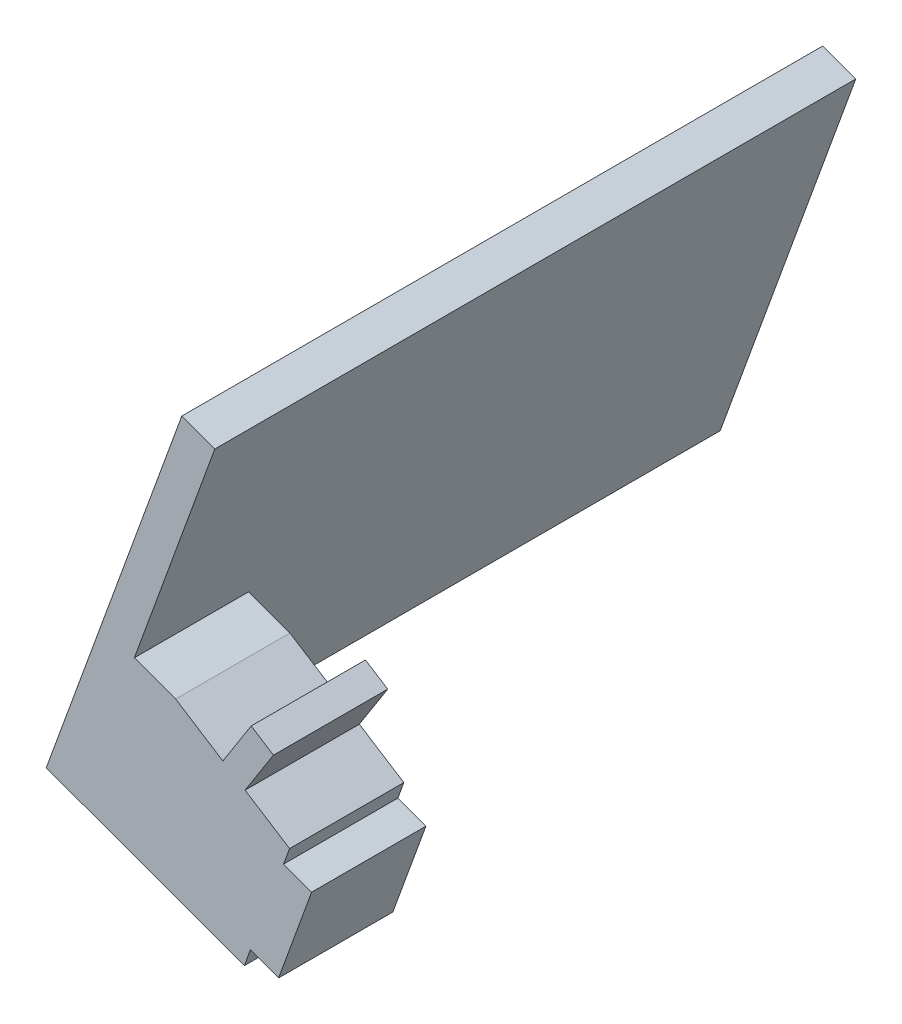
ISO-10303-21;
HEADER;
FILE_DESCRIPTION(('STEP AP214'),'2;1');
FILE_NAME('part.step','',(''),(''),'','','');
FILE_SCHEMA(('AUTOMOTIVE_DESIGN { 1 0 10303 214 1 1 1 1 }'));
ENDSEC;
DATA;
#1=APPLICATION_CONTEXT('core data for automotive mechanical design processes');
#2=APPLICATION_PROTOCOL_DEFINITION('international standard','automotive_design',2000,#1);
#3=PRODUCT_CONTEXT('',#1,'mechanical');
#4=PRODUCT('Part','Part','',(#3));
#5=PRODUCT_RELATED_PRODUCT_CATEGORY('part','',(#4));
#6=PRODUCT_DEFINITION_FORMATION('','',#4);
#7=PRODUCT_DEFINITION_CONTEXT('part definition',#1,'design');
#8=PRODUCT_DEFINITION('design','',#6,#7);
#9=PRODUCT_DEFINITION_SHAPE('','',#8);
#10=(LENGTH_UNIT() NAMED_UNIT(*) SI_UNIT(.MILLI.,.METRE.));
#11=(NAMED_UNIT(*) PLANE_ANGLE_UNIT() SI_UNIT($,.RADIAN.));
#12=(NAMED_UNIT(*) SI_UNIT($,.STERADIAN.) SOLID_ANGLE_UNIT());
#13=UNCERTAINTY_MEASURE_WITH_UNIT(LENGTH_MEASURE(1.E-05),#10,'distance_accuracy_value','');
#14=(GEOMETRIC_REPRESENTATION_CONTEXT(3) GLOBAL_UNCERTAINTY_ASSIGNED_CONTEXT((#13)) GLOBAL_UNIT_ASSIGNED_CONTEXT((#10,
#11,#12)) REPRESENTATION_CONTEXT('',''));
#15=CARTESIAN_POINT('',(0.,0.,0.));
#16=DIRECTION('',(0.,0.,1.));
#17=DIRECTION('',(1.,0.,0.));
#18=AXIS2_PLACEMENT_3D('',#15,#16,#17);
#19=CARTESIAN_POINT('',(26.5891749560917,8.90987720718114,67.31));
#20=DIRECTION('',(0.342020143325674,0.939692620785907,0.));
#21=DIRECTION('',(-0.939692620785907,0.342020143325674,0.));
#22=AXIS2_PLACEMENT_3D('',#19,#20,#21);
#23=PLANE('',#22);
#24=DIRECTION('',(0.939692620785906,-0.342020143325674,0.));
#25=VECTOR('',#24,1.);
#26=CARTESIAN_POINT('',(26.5891749560917,8.90987720718114,50.8));
#27=LINE('',#26,#25);
#28=CARTESIAN_POINT('',(2.72098238812966,17.5971888476533,50.8));
#29=VERTEX_POINT('',#28);
#30=CARTESIAN_POINT('',(26.5891749560917,8.90987720718114,50.8));
#31=VERTEX_POINT('',#30);
#32=EDGE_CURVE('E207',#29,#31,#27,.T.);
#33=ORIENTED_EDGE('',*,*,#32,.T.);
#34=DIRECTION('',(0.,0.,-1.));
#35=VECTOR('',#34,1.);
#36=CARTESIAN_POINT('',(26.5891749560917,8.90987720718114,67.31));
#37=LINE('',#36,#35);
#38=CARTESIAN_POINT('',(26.5891749560917,8.90987720718114,67.31));
#39=VERTEX_POINT('',#38);
#40=EDGE_CURVE('E11',#39,#31,#37,.T.);
#41=ORIENTED_EDGE('',*,*,#40,.F.);
#42=DIRECTION('',(0.939692620785906,-0.342020143325674,0.));
#43=VECTOR('',#42,1.);
#44=CARTESIAN_POINT('',(26.5891749560917,8.90987720718114,67.31));
#45=LINE('',#44,#43);
#46=CARTESIAN_POINT('',(-2.05265612546275,19.3346511757477,67.31));
#47=VERTEX_POINT('',#46);
#48=EDGE_CURVE('E140',#47,#39,#45,.T.);
#49=ORIENTED_EDGE('',*,*,#48,.F.);
#50=DIRECTION('',(0.,0.,-1.));
#51=VECTOR('',#50,1.);
#52=CARTESIAN_POINT('',(-2.05265612546275,19.3346511757477,23.6434303938957));
#53=LINE('',#52,#51);
#54=CARTESIAN_POINT('',(-2.05265612546274,19.3346511757477,-25.2953200481443));
#55=VERTEX_POINT('',#54);
#56=EDGE_CURVE('E145',#47,#55,#53,.T.);
#57=ORIENTED_EDGE('',*,*,#56,.T.);
#58=DIRECTION('',(0.939692620785906,-0.342020143325674,0.));
#59=VECTOR('',#58,1.);
#60=CARTESIAN_POINT('',(-2.05265612546274,19.3346511757477,-25.2953200481443));
#61=LINE('',#60,#59);
#62=CARTESIAN_POINT('',(2.72098238812966,17.5971888476533,-25.2953200481443));
#63=VERTEX_POINT('',#62);
#64=EDGE_CURVE('E172',#55,#63,#61,.T.);
#65=ORIENTED_EDGE('',*,*,#64,.T.);
#66=DIRECTION('',(0.,0.,-1.));
#67=VECTOR('',#66,1.);
#68=CARTESIAN_POINT('',(2.72098238812966,17.5971888476533,23.6434303938957));
#69=LINE('',#68,#67);
#70=EDGE_CURVE('E173',#29,#63,#69,.T.);
#71=ORIENTED_EDGE('',*,*,#70,.F.);
#72=EDGE_LOOP('',(#33,#41,#49,#57,#65,#71));
#73=FACE_BOUND('',#72,.T.);
#74=ADVANCED_FACE('F33',(#73),#23,.F.);
#75=CARTESIAN_POINT('',(27.4307878496081,11.3065667072553,67.31));
#76=DIRECTION('',(-0.943517647033136,0.331322274737234,0.));
#77=DIRECTION('',(-0.331322274737234,-0.943517647033136,0.));
#78=AXIS2_PLACEMENT_3D('',#75,#76,#77);
#79=PLANE('',#78);
#80=DIRECTION('',(0.331322274737234,0.943517647033136,0.));
#81=VECTOR('',#80,1.);
#82=CARTESIAN_POINT('',(27.4307878496081,11.3065667072553,50.8));
#83=LINE('',#82,#81);
#84=CARTESIAN_POINT('',(27.4307878496081,11.3065667072553,50.8));
#85=VERTEX_POINT('',#84);
#86=EDGE_CURVE('E209',#31,#85,#83,.T.);
#87=ORIENTED_EDGE('',*,*,#86,.T.);
#88=DIRECTION('',(0.,0.,-1.));
#89=VECTOR('',#88,1.);
#90=CARTESIAN_POINT('',(27.4307878496081,11.3065667072553,67.31));
#91=LINE('',#90,#89);
#92=CARTESIAN_POINT('',(27.4307878496081,11.3065667072553,67.31));
#93=VERTEX_POINT('',#92);
#94=EDGE_CURVE('E41',#93,#85,#91,.T.);
#95=ORIENTED_EDGE('',*,*,#94,.F.);
#96=DIRECTION('',(0.331322274737234,0.943517647033136,0.));
#97=VECTOR('',#96,1.);
#98=CARTESIAN_POINT('',(27.4307878496081,11.3065667072553,67.31));
#99=LINE('',#98,#97);
#100=EDGE_CURVE('E148',#39,#93,#99,.T.);
#101=ORIENTED_EDGE('',*,*,#100,.F.);
#102=ORIENTED_EDGE('',*,*,#40,.T.);
#103=EDGE_LOOP('',(#87,#95,#101,#102));
#104=FACE_BOUND('',#103,.T.);
#105=ADVANCED_FACE('F276',(#104),#79,.F.);
#106=CARTESIAN_POINT('',(31.5154988566924,9.81985348509709,67.31));
#107=DIRECTION('',(0.342020143325674,0.939692620785906,0.));
#108=DIRECTION('',(-0.939692620785906,0.342020143325674,0.));
#109=AXIS2_PLACEMENT_3D('',#106,#107,#108);
#110=PLANE('',#109);
#111=DIRECTION('',(0.939692620785907,-0.342020143325674,0.));
#112=VECTOR('',#111,1.);
#113=CARTESIAN_POINT('',(31.5154988566924,9.81985348509709,50.8));
#114=LINE('',#113,#112);
#115=CARTESIAN_POINT('',(31.5154988566924,9.81985348509709,50.8));
#116=VERTEX_POINT('',#115);
#117=EDGE_CURVE('E212',#85,#116,#114,.T.);
#118=ORIENTED_EDGE('',*,*,#117,.T.);
#119=DIRECTION('',(0.,0.,-1.));
#120=VECTOR('',#119,1.);
#121=CARTESIAN_POINT('',(31.5154988566924,9.81985348509709,67.31));
#122=LINE('',#121,#120);
#123=CARTESIAN_POINT('',(31.5154988566924,9.81985348509709,67.31));
#124=VERTEX_POINT('',#123);
#125=EDGE_CURVE('E267',#124,#116,#122,.T.);
#126=ORIENTED_EDGE('',*,*,#125,.F.);
#127=DIRECTION('',(0.939692620785907,-0.342020143325674,0.));
#128=VECTOR('',#127,1.);
#129=CARTESIAN_POINT('',(31.5154988566924,9.81985348509709,67.31));
#130=LINE('',#129,#128);
#131=EDGE_CURVE('E185',#93,#124,#130,.T.);
#132=ORIENTED_EDGE('',*,*,#131,.F.);
#133=ORIENTED_EDGE('',*,*,#94,.T.);
#134=EDGE_LOOP('',(#118,#126,#132,#133));
#135=FACE_BOUND('',#134,.T.);
#136=ADVANCED_FACE('F273',(#135),#110,.F.);
#137=CARTESIAN_POINT('',(36.2935202589521,22.9473593974762,67.31));
#138=DIRECTION('',(-0.939692620785906,0.342020143325674,0.));
#139=DIRECTION('',(-0.342020143325674,-0.939692620785906,0.));
#140=AXIS2_PLACEMENT_3D('',#137,#138,#139);
#141=PLANE('',#140);
#142=DIRECTION('',(0.342020143325674,0.939692620785907,0.));
#143=VECTOR('',#142,1.);
#144=CARTESIAN_POINT('',(36.2935202589521,22.9473593974762,50.8));
#145=LINE('',#144,#143);
#146=CARTESIAN_POINT('',(36.2935202589521,22.9473593974762,50.8));
#147=VERTEX_POINT('',#146);
#148=EDGE_CURVE('E215',#116,#147,#145,.T.);
#149=ORIENTED_EDGE('',*,*,#148,.T.);
#150=DIRECTION('',(0.,0.,-1.));
#151=VECTOR('',#150,1.);
#152=CARTESIAN_POINT('',(36.2935202589521,22.9473593974762,67.31));
#153=LINE('',#152,#151);
#154=CARTESIAN_POINT('',(36.2935202589521,22.9473593974762,67.31));
#155=VERTEX_POINT('',#154);
#156=EDGE_CURVE('E264',#155,#147,#153,.T.);
#157=ORIENTED_EDGE('',*,*,#156,.F.);
#158=DIRECTION('',(0.342020143325674,0.939692620785907,0.));
#159=VECTOR('',#158,1.);
#160=CARTESIAN_POINT('',(36.2935202589521,22.9473593974762,67.31));
#161=LINE('',#160,#159);
#162=EDGE_CURVE('E187',#124,#155,#161,.T.);
#163=ORIENTED_EDGE('',*,*,#162,.F.);
#164=ORIENTED_EDGE('',*,*,#125,.T.);
#165=EDGE_LOOP('',(#149,#157,#163,#164));
#166=FACE_BOUND('',#165,.T.);
#167=ADVANCED_FACE('F317',(#166),#141,.F.);
#168=CARTESIAN_POINT('',(32.2389763793897,24.4325790420947,67.31));
#169=DIRECTION('',(-0.343959351478395,-0.938984539026369,0.));
#170=DIRECTION('',(0.938984539026369,-0.343959351478395,0.));
#171=AXIS2_PLACEMENT_3D('',#168,#169,#170);
#172=PLANE('',#171);
#173=DIRECTION('',(-0.938984539026369,0.343959351478395,0.));
#174=VECTOR('',#173,1.);
#175=CARTESIAN_POINT('',(32.2389763793897,24.4325790420947,50.8));
#176=LINE('',#175,#174);
#177=CARTESIAN_POINT('',(32.2389763793897,24.4325790420947,50.8));
#178=VERTEX_POINT('',#177);
#179=EDGE_CURVE('E218',#147,#178,#176,.T.);
#180=ORIENTED_EDGE('',*,*,#179,.T.);
#181=DIRECTION('',(0.,0.,-1.));
#182=VECTOR('',#181,1.);
#183=CARTESIAN_POINT('',(32.2389763793897,24.4325790420947,67.31));
#184=LINE('',#183,#182);
#185=CARTESIAN_POINT('',(32.2389763793897,24.4325790420947,67.31));
#186=VERTEX_POINT('',#185);
#187=EDGE_CURVE('E261',#186,#178,#184,.T.);
#188=ORIENTED_EDGE('',*,*,#187,.F.);
#189=DIRECTION('',(-0.938984539026369,0.343959351478395,0.));
#190=VECTOR('',#189,1.);
#191=CARTESIAN_POINT('',(32.2389763793897,24.4325790420947,67.31));
#192=LINE('',#191,#190);
#193=EDGE_CURVE('E189',#155,#186,#192,.T.);
#194=ORIENTED_EDGE('',*,*,#193,.F.);
#195=ORIENTED_EDGE('',*,*,#156,.T.);
#196=EDGE_LOOP('',(#180,#188,#194,#195));
#197=FACE_BOUND('',#196,.T.);
#198=ADVANCED_FACE('F314',(#197),#172,.F.);
#199=CARTESIAN_POINT('',(33.1046586864458,26.8110216331527,67.31));
#200=DIRECTION('',(-0.939692620785906,0.342020143325674,0.));
#201=DIRECTION('',(-0.342020143325674,-0.939692620785906,0.));
#202=AXIS2_PLACEMENT_3D('',#199,#200,#201);
#203=PLANE('',#202);
#204=DIRECTION('',(0.342020143325674,0.939692620785906,0.));
#205=VECTOR('',#204,1.);
#206=CARTESIAN_POINT('',(33.1046586864458,26.8110216331527,50.8));
#207=LINE('',#206,#205);
#208=CARTESIAN_POINT('',(33.1046586864458,26.8110216331527,50.8));
#209=VERTEX_POINT('',#208);
#210=EDGE_CURVE('E221',#178,#209,#207,.T.);
#211=ORIENTED_EDGE('',*,*,#210,.T.);
#212=DIRECTION('',(0.,0.,-1.));
#213=VECTOR('',#212,1.);
#214=CARTESIAN_POINT('',(33.1046586864458,26.8110216331527,67.31));
#215=LINE('',#214,#213);
#216=CARTESIAN_POINT('',(33.1046586864458,26.8110216331527,67.31));
#217=VERTEX_POINT('',#216);
#218=EDGE_CURVE('E258',#217,#209,#215,.T.);
#219=ORIENTED_EDGE('',*,*,#218,.F.);
#220=DIRECTION('',(0.342020143325674,0.939692620785906,0.));
#221=VECTOR('',#220,1.);
#222=CARTESIAN_POINT('',(33.1046586864458,26.8110216331527,67.31));
#223=LINE('',#222,#221);
#224=EDGE_CURVE('E191',#186,#217,#223,.T.);
#225=ORIENTED_EDGE('',*,*,#224,.F.);
#226=ORIENTED_EDGE('',*,*,#187,.T.);
#227=EDGE_LOOP('',(#211,#219,#225,#226));
#228=FACE_BOUND('',#227,.T.);
#229=ADVANCED_FACE('F309',(#228),#203,.F.);
#230=CARTESIAN_POINT('',(26.6780158693516,30.9052446487555,67.31));
#231=DIRECTION('',(-0.537299608346825,-0.843391445812885,0.));
#232=DIRECTION('',(0.843391445812885,-0.537299608346825,0.));
#233=AXIS2_PLACEMENT_3D('',#230,#231,#232);
#234=PLANE('',#233);
#235=DIRECTION('',(-0.843391445812885,0.537299608346825,0.));
#236=VECTOR('',#235,1.);
#237=CARTESIAN_POINT('',(26.6780158693516,30.9052446487555,50.8));
#238=LINE('',#237,#236);
#239=CARTESIAN_POINT('',(26.6780158693516,30.9052446487555,50.8));
#240=VERTEX_POINT('',#239);
#241=EDGE_CURVE('E224',#209,#240,#238,.T.);
#242=ORIENTED_EDGE('',*,*,#241,.T.);
#243=DIRECTION('',(0.,0.,-1.));
#244=VECTOR('',#243,1.);
#245=CARTESIAN_POINT('',(26.6780158693516,30.9052446487555,67.31));
#246=LINE('',#245,#244);
#247=CARTESIAN_POINT('',(26.6780158693516,30.9052446487555,67.31));
#248=VERTEX_POINT('',#247);
#249=EDGE_CURVE('E255',#248,#240,#246,.T.);
#250=ORIENTED_EDGE('',*,*,#249,.F.);
#251=DIRECTION('',(-0.843391445812885,0.537299608346825,0.));
#252=VECTOR('',#251,1.);
#253=CARTESIAN_POINT('',(26.6780158693516,30.9052446487555,67.31));
#254=LINE('',#253,#252);
#255=EDGE_CURVE('E193',#217,#248,#254,.T.);
#256=ORIENTED_EDGE('',*,*,#255,.F.);
#257=ORIENTED_EDGE('',*,*,#218,.T.);
#258=EDGE_LOOP('',(#242,#250,#256,#257));
#259=FACE_BOUND('',#258,.T.);
#260=ADVANCED_FACE('F306',(#259),#234,.F.);
#261=CARTESIAN_POINT('',(30.7722388849544,37.3318874658497,67.31));
#262=DIRECTION('',(-0.843391445812884,0.537299608346826,0.));
#263=DIRECTION('',(-0.537299608346826,-0.843391445812884,0.));
#264=AXIS2_PLACEMENT_3D('',#261,#262,#263);
#265=PLANE('',#264);
#266=DIRECTION('',(0.537299608346826,0.843391445812884,0.));
#267=VECTOR('',#266,1.);
#268=CARTESIAN_POINT('',(30.7722388849544,37.3318874658497,50.8));
#269=LINE('',#268,#267);
#270=CARTESIAN_POINT('',(30.7722388849544,37.3318874658497,50.8));
#271=VERTEX_POINT('',#270);
#272=EDGE_CURVE('E227',#240,#271,#269,.T.);
#273=ORIENTED_EDGE('',*,*,#272,.T.);
#274=DIRECTION('',(0.,0.,-1.));
#275=VECTOR('',#274,1.);
#276=CARTESIAN_POINT('',(30.7722388849544,37.3318874658497,67.31));
#277=LINE('',#276,#275);
#278=CARTESIAN_POINT('',(30.7722388849544,37.3318874658497,67.31));
#279=VERTEX_POINT('',#278);
#280=EDGE_CURVE('E252',#279,#271,#277,.T.);
#281=ORIENTED_EDGE('',*,*,#280,.F.);
#282=DIRECTION('',(0.537299608346826,0.843391445812884,0.));
#283=VECTOR('',#282,1.);
#284=CARTESIAN_POINT('',(30.7722388849544,37.3318874658497,67.31));
#285=LINE('',#284,#283);
#286=EDGE_CURVE('E195',#248,#279,#285,.T.);
#287=ORIENTED_EDGE('',*,*,#286,.F.);
#288=ORIENTED_EDGE('',*,*,#249,.T.);
#289=EDGE_LOOP('',(#273,#281,#287,#288));
#290=FACE_BOUND('',#289,.T.);
#291=ADVANCED_FACE('F301',(#290),#265,.F.);
#292=CARTESIAN_POINT('',(27.5589174764073,39.3789989736511,67.31));
#293=DIRECTION('',(-0.537299608346826,-0.843391445812884,0.));
#294=DIRECTION('',(0.843391445812884,-0.537299608346826,0.));
#295=AXIS2_PLACEMENT_3D('',#292,#293,#294);
#296=PLANE('',#295);
#297=DIRECTION('',(-0.843391445812884,0.537299608346826,0.));
#298=VECTOR('',#297,1.);
#299=CARTESIAN_POINT('',(27.5589174764073,39.3789989736511,50.8));
#300=LINE('',#299,#298);
#301=CARTESIAN_POINT('',(27.5589174764073,39.3789989736511,50.8));
#302=VERTEX_POINT('',#301);
#303=EDGE_CURVE('E230',#271,#302,#300,.T.);
#304=ORIENTED_EDGE('',*,*,#303,.T.);
#305=DIRECTION('',(0.,0.,-1.));
#306=VECTOR('',#305,1.);
#307=CARTESIAN_POINT('',(27.5589174764073,39.3789989736511,67.31));
#308=LINE('',#307,#306);
#309=CARTESIAN_POINT('',(27.5589174764073,39.3789989736511,67.31));
#310=VERTEX_POINT('',#309);
#311=EDGE_CURVE('E249',#310,#302,#308,.T.);
#312=ORIENTED_EDGE('',*,*,#311,.F.);
#313=DIRECTION('',(-0.843391445812884,0.537299608346826,0.));
#314=VECTOR('',#313,1.);
#315=CARTESIAN_POINT('',(27.5589174764073,39.3789989736511,67.31));
#316=LINE('',#315,#314);
#317=EDGE_CURVE('E197',#279,#310,#316,.T.);
#318=ORIENTED_EDGE('',*,*,#317,.F.);
#319=ORIENTED_EDGE('',*,*,#280,.T.);
#320=EDGE_LOOP('',(#304,#312,#318,#319));
#321=FACE_BOUND('',#320,.T.);
#322=ADVANCED_FACE('F298',(#321),#296,.F.);
#323=CARTESIAN_POINT('',(23.4646944608045,32.9523561565569,67.31));
#324=DIRECTION('',(0.843391445812884,-0.537299608346827,0.));
#325=DIRECTION('',(0.537299608346827,0.843391445812884,0.));
#326=AXIS2_PLACEMENT_3D('',#323,#324,#325);
#327=PLANE('',#326);
#328=DIRECTION('',(-0.537299608346827,-0.843391445812884,0.));
#329=VECTOR('',#328,1.);
#330=CARTESIAN_POINT('',(23.4646944608045,32.9523561565569,50.8));
#331=LINE('',#330,#329);
#332=CARTESIAN_POINT('',(23.4646944608045,32.9523561565569,50.8));
#333=VERTEX_POINT('',#332);
#334=EDGE_CURVE('E233',#302,#333,#331,.T.);
#335=ORIENTED_EDGE('',*,*,#334,.T.);
#336=DIRECTION('',(0.,0.,-1.));
#337=VECTOR('',#336,1.);
#338=CARTESIAN_POINT('',(23.4646944608045,32.9523561565569,67.31));
#339=LINE('',#338,#337);
#340=CARTESIAN_POINT('',(23.4646944608045,32.9523561565569,67.31));
#341=VERTEX_POINT('',#340);
#342=EDGE_CURVE('E246',#341,#333,#339,.T.);
#343=ORIENTED_EDGE('',*,*,#342,.F.);
#344=DIRECTION('',(-0.537299608346827,-0.843391445812884,0.));
#345=VECTOR('',#344,1.);
#346=CARTESIAN_POINT('',(23.4646944608045,32.9523561565569,67.31));
#347=LINE('',#346,#345);
#348=EDGE_CURVE('E199',#310,#341,#347,.T.);
#349=ORIENTED_EDGE('',*,*,#348,.F.);
#350=ORIENTED_EDGE('',*,*,#311,.T.);
#351=EDGE_LOOP('',(#335,#343,#349,#350));
#352=FACE_BOUND('',#351,.T.);
#353=ADVANCED_FACE('F293',(#352),#327,.F.);
#354=CARTESIAN_POINT('',(16.6479622280307,37.295093537945,67.31));
#355=DIRECTION('',(-0.537299608346825,-0.843391445812885,0.));
#356=DIRECTION('',(0.843391445812885,-0.537299608346825,0.));
#357=AXIS2_PLACEMENT_3D('',#354,#355,#356);
#358=PLANE('',#357);
#359=DIRECTION('',(-0.843391445812885,0.537299608346825,0.));
#360=VECTOR('',#359,1.);
#361=CARTESIAN_POINT('',(16.6479622280307,37.295093537945,50.8));
#362=LINE('',#361,#360);
#363=CARTESIAN_POINT('',(16.6479622280307,37.295093537945,50.8));
#364=VERTEX_POINT('',#363);
#365=EDGE_CURVE('E236',#333,#364,#362,.T.);
#366=ORIENTED_EDGE('',*,*,#365,.T.);
#367=DIRECTION('',(0.,0.,-1.));
#368=VECTOR('',#367,1.);
#369=CARTESIAN_POINT('',(16.6479622280307,37.295093537945,67.31));
#370=LINE('',#369,#368);
#371=CARTESIAN_POINT('',(16.6479622280307,37.295093537945,67.31));
#372=VERTEX_POINT('',#371);
#373=EDGE_CURVE('E243',#372,#364,#370,.T.);
#374=ORIENTED_EDGE('',*,*,#373,.F.);
#375=DIRECTION('',(-0.843391445812885,0.537299608346825,0.));
#376=VECTOR('',#375,1.);
#377=CARTESIAN_POINT('',(16.6479622280307,37.295093537945,67.31));
#378=LINE('',#377,#376);
#379=EDGE_CURVE('E201',#341,#372,#378,.T.);
#380=ORIENTED_EDGE('',*,*,#379,.F.);
#381=ORIENTED_EDGE('',*,*,#342,.T.);
#382=EDGE_LOOP('',(#366,#374,#380,#381));
#383=FACE_BOUND('',#382,.T.);
#384=ADVANCED_FACE('F290',(#383),#358,.F.);
#385=CARTESIAN_POINT('',(10.6809140860401,39.466921448063,67.31));
#386=DIRECTION('',(-0.342020143325674,-0.939692620785907,0.));
#387=DIRECTION('',(0.939692620785907,-0.342020143325674,0.));
#388=AXIS2_PLACEMENT_3D('',#385,#386,#387);
#389=PLANE('',#388);
#390=DIRECTION('',(-0.939692620785906,0.342020143325674,0.));
#391=VECTOR('',#390,1.);
#392=CARTESIAN_POINT('',(10.6809140860401,39.466921448063,50.8));
#393=LINE('',#392,#391);
#394=CARTESIAN_POINT('',(10.6809140860401,39.466921448063,50.8));
#395=VERTEX_POINT('',#394);
#396=EDGE_CURVE('E149',#364,#395,#393,.T.);
#397=ORIENTED_EDGE('',*,*,#396,.T.);
#398=DIRECTION('',(0.,0.,-1.));
#399=VECTOR('',#398,1.);
#400=CARTESIAN_POINT('',(10.6809140860401,39.466921448063,67.31));
#401=LINE('',#400,#399);
#402=CARTESIAN_POINT('',(10.6809140860401,39.466921448063,67.31));
#403=VERTEX_POINT('',#402);
#404=EDGE_CURVE('E204',#403,#395,#401,.T.);
#405=ORIENTED_EDGE('',*,*,#404,.F.);
#406=DIRECTION('',(-0.939692620785906,0.342020143325674,0.));
#407=VECTOR('',#406,1.);
#408=CARTESIAN_POINT('',(10.6809140860401,39.466921448063,67.31));
#409=LINE('',#408,#407);
#410=EDGE_CURVE('E48',#372,#403,#409,.T.);
#411=ORIENTED_EDGE('',*,*,#410,.F.);
#412=ORIENTED_EDGE('',*,*,#373,.T.);
#413=EDGE_LOOP('',(#397,#405,#411,#412));
#414=FACE_BOUND('',#413,.T.);
#415=ADVANCED_FACE('F286',(#414),#389,.F.);
#416=CARTESIAN_POINT('',(10.6809140860401,39.466921448063,67.31));
#417=DIRECTION('',(0.,0.,-1.));
#418=DIRECTION('',(-1.,0.,0.));
#419=AXIS2_PLACEMENT_3D('',#416,#417,#418);
#420=PLANE('',#419);
#421=ORIENTED_EDGE('',*,*,#410,.T.);
#422=DIRECTION('',(0.342020143325674,0.939692620785907,0.));
#423=VECTOR('',#422,1.);
#424=CARTESIAN_POINT('',(-16.4862665636659,-35.1742939372476,67.31));
#425=LINE('',#424,#423);
#426=CARTESIAN_POINT('',(22.3033390885487,71.3992717017594,67.31));
#427=VERTEX_POINT('',#426);
#428=EDGE_CURVE('E175',#403,#427,#425,.T.);
#429=ORIENTED_EDGE('',*,*,#428,.T.);
#430=DIRECTION('',(0.939692620785906,-0.342020143325674,0.));
#431=VECTOR('',#430,1.);
#432=CARTESIAN_POINT('',(17.5297005749563,73.1367340298539,67.31));
#433=LINE('',#432,#431);
#434=CARTESIAN_POINT('',(17.5297005749563,73.1367340298539,67.31));
#435=VERTEX_POINT('',#434);
#436=EDGE_CURVE('E155',#435,#427,#433,.T.);
#437=ORIENTED_EDGE('',*,*,#436,.F.);
#438=DIRECTION('',(0.342020143325674,0.939692620785907,0.));
#439=VECTOR('',#438,1.);
#440=CARTESIAN_POINT('',(-21.2599050772583,-33.4368316091532,67.31));
#441=LINE('',#440,#439);
#442=EDGE_CURVE('E152',#47,#435,#441,.T.);
#443=ORIENTED_EDGE('',*,*,#442,.F.);
#444=ORIENTED_EDGE('',*,*,#48,.T.);
#445=ORIENTED_EDGE('',*,*,#100,.T.);
#446=ORIENTED_EDGE('',*,*,#131,.T.);
#447=ORIENTED_EDGE('',*,*,#162,.T.);
#448=ORIENTED_EDGE('',*,*,#193,.T.);
#449=ORIENTED_EDGE('',*,*,#224,.T.);
#450=ORIENTED_EDGE('',*,*,#255,.T.);
#451=ORIENTED_EDGE('',*,*,#286,.T.);
#452=ORIENTED_EDGE('',*,*,#317,.T.);
#453=ORIENTED_EDGE('',*,*,#348,.T.);
#454=ORIENTED_EDGE('',*,*,#379,.T.);
#455=EDGE_LOOP('',(#421,#429,#437,#443,#444,#445,#446,#447,#448,#449,#450,#451,#452,#453,#454));
#456=FACE_BOUND('',#455,.T.);
#457=ADVANCED_FACE('F153',(#456),#420,.F.);
#458=CARTESIAN_POINT('',(203.2,508.,50.8));
#459=DIRECTION('',(0.,0.,1.));
#460=DIRECTION('',(1.,0.,0.));
#461=AXIS2_PLACEMENT_3D('',#458,#459,#460);
#462=PLANE('',#461);
#463=ORIENTED_EDGE('',*,*,#396,.F.);
#464=ORIENTED_EDGE('',*,*,#365,.F.);
#465=ORIENTED_EDGE('',*,*,#334,.F.);
#466=ORIENTED_EDGE('',*,*,#303,.F.);
#467=ORIENTED_EDGE('',*,*,#272,.F.);
#468=ORIENTED_EDGE('',*,*,#241,.F.);
#469=ORIENTED_EDGE('',*,*,#210,.F.);
#470=ORIENTED_EDGE('',*,*,#179,.F.);
#471=ORIENTED_EDGE('',*,*,#148,.F.);
#472=ORIENTED_EDGE('',*,*,#117,.F.);
#473=ORIENTED_EDGE('',*,*,#86,.F.);
#474=ORIENTED_EDGE('',*,*,#32,.F.);
#475=DIRECTION('',(-0.342020143325674,-0.939692620785906,0.));
#476=VECTOR('',#475,1.);
#477=CARTESIAN_POINT('',(2.72098238812966,17.5971888476533,50.8));
#478=LINE('',#477,#476);
#479=EDGE_CURVE('E182',#395,#29,#478,.T.);
#480=ORIENTED_EDGE('',*,*,#479,.F.);
#481=EDGE_LOOP('',(#463,#464,#465,#466,#467,#468,#469,#470,#471,#472,#473,#474,#480));
#482=FACE_BOUND('',#481,.T.);
#483=ADVANCED_FACE('F278',(#482),#462,.F.);
#484=CARTESIAN_POINT('',(-16.4862665636659,-35.1742939372476,23.6434303938957));
#485=DIRECTION('',(-0.939692620785907,0.342020143325674,0.));
#486=DIRECTION('',(-0.342020143325674,-0.939692620785907,0.));
#487=AXIS2_PLACEMENT_3D('',#484,#485,#486);
#488=PLANE('',#487);
#489=ORIENTED_EDGE('',*,*,#428,.F.);
#490=ORIENTED_EDGE('',*,*,#404,.T.);
#491=ORIENTED_EDGE('',*,*,#479,.T.);
#492=ORIENTED_EDGE('',*,*,#70,.T.);
#493=DIRECTION('',(0.342020143325674,0.939692620785907,0.));
#494=VECTOR('',#493,1.);
#495=CARTESIAN_POINT('',(-16.4862665636659,-35.1742939372476,-25.2953200481443));
#496=LINE('',#495,#494);
#497=CARTESIAN_POINT('',(22.3033390885487,71.3992717017594,-25.2953200481443));
#498=VERTEX_POINT('',#497);
#499=EDGE_CURVE('E164',#63,#498,#496,.T.);
#500=ORIENTED_EDGE('',*,*,#499,.T.);
#501=DIRECTION('',(0.,0.,1.));
#502=VECTOR('',#501,1.);
#503=CARTESIAN_POINT('',(22.3033390885487,71.3992717017594,23.6434303938957));
#504=LINE('',#503,#502);
#505=EDGE_CURVE('E167',#498,#427,#504,.T.);
#506=ORIENTED_EDGE('',*,*,#505,.T.);
#507=EDGE_LOOP('',(#489,#490,#491,#492,#500,#506));
#508=FACE_BOUND('',#507,.T.);
#509=ADVANCED_FACE('F284',(#508),#488,.F.);
#510=CARTESIAN_POINT('',(17.5297005749563,73.1367340298539,23.6434303938957));
#511=DIRECTION('',(0.342020143325674,0.939692620785906,0.));
#512=DIRECTION('',(-0.939692620785906,0.342020143325674,0.));
#513=AXIS2_PLACEMENT_3D('',#510,#511,#512);
#514=PLANE('',#513);
#515=ORIENTED_EDGE('',*,*,#505,.F.);
#516=DIRECTION('',(0.939692620785906,-0.342020143325674,0.));
#517=VECTOR('',#516,1.);
#518=CARTESIAN_POINT('',(17.5297005749563,73.1367340298539,-25.2953200481443));
#519=LINE('',#518,#517);
#520=CARTESIAN_POINT('',(17.5297005749563,73.1367340298539,-25.2953200481443));
#521=VERTEX_POINT('',#520);
#522=EDGE_CURVE('E180',#521,#498,#519,.T.);
#523=ORIENTED_EDGE('',*,*,#522,.F.);
#524=DIRECTION('',(0.,0.,1.));
#525=VECTOR('',#524,1.);
#526=CARTESIAN_POINT('',(17.5297005749563,73.1367340298539,23.6434303938957));
#527=LINE('',#526,#525);
#528=EDGE_CURVE('E159',#521,#435,#527,.T.);
#529=ORIENTED_EDGE('',*,*,#528,.T.);
#530=ORIENTED_EDGE('',*,*,#436,.T.);
#531=EDGE_LOOP('',(#515,#523,#529,#530));
#532=FACE_BOUND('',#531,.T.);
#533=ADVANCED_FACE('F437',(#532),#514,.T.);
#534=CARTESIAN_POINT('',(-21.2599050772583,-33.4368316091532,-25.2953200481443));
#535=DIRECTION('',(0.,0.,-1.));
#536=DIRECTION('',(-1.,0.,0.));
#537=AXIS2_PLACEMENT_3D('',#534,#535,#536);
#538=PLANE('',#537);
#539=ORIENTED_EDGE('',*,*,#499,.F.);
#540=ORIENTED_EDGE('',*,*,#64,.F.);
#541=DIRECTION('',(0.342020143325674,0.939692620785907,0.));
#542=VECTOR('',#541,1.);
#543=CARTESIAN_POINT('',(-21.2599050772583,-33.4368316091532,-25.2953200481443));
#544=LINE('',#543,#542);
#545=EDGE_CURVE('E163',#55,#521,#544,.T.);
#546=ORIENTED_EDGE('',*,*,#545,.T.);
#547=ORIENTED_EDGE('',*,*,#522,.T.);
#548=EDGE_LOOP('',(#539,#540,#546,#547));
#549=FACE_BOUND('',#548,.T.);
#550=ADVANCED_FACE('F447',(#549),#538,.T.);
#551=CARTESIAN_POINT('',(-21.2599050772583,-33.4368316091532,23.6434303938957));
#552=DIRECTION('',(-0.939692620785907,0.342020143325674,0.));
#553=DIRECTION('',(-0.342020143325674,-0.939692620785907,0.));
#554=AXIS2_PLACEMENT_3D('',#551,#552,#553);
#555=PLANE('',#554);
#556=ORIENTED_EDGE('',*,*,#56,.F.);
#557=ORIENTED_EDGE('',*,*,#442,.T.);
#558=ORIENTED_EDGE('',*,*,#528,.F.);
#559=ORIENTED_EDGE('',*,*,#545,.F.);
#560=EDGE_LOOP('',(#556,#557,#558,#559));
#561=FACE_BOUND('',#560,.T.);
#562=ADVANCED_FACE('F161',(#561),#555,.T.);
#563=CLOSED_SHELL('',(#74,#105,#136,#167,#198,#229,#260,#291,#322,#353,#384,#415,#457,#483,#509,
#533,#550,#562));
#564=MANIFOLD_SOLID_BREP('B2',#563);
#565=ADVANCED_BREP_SHAPE_REPRESENTATION('',(#18,#564),#14);
#566=SHAPE_DEFINITION_REPRESENTATION(#9,#565);
ENDSEC;
END-ISO-10303-21;
